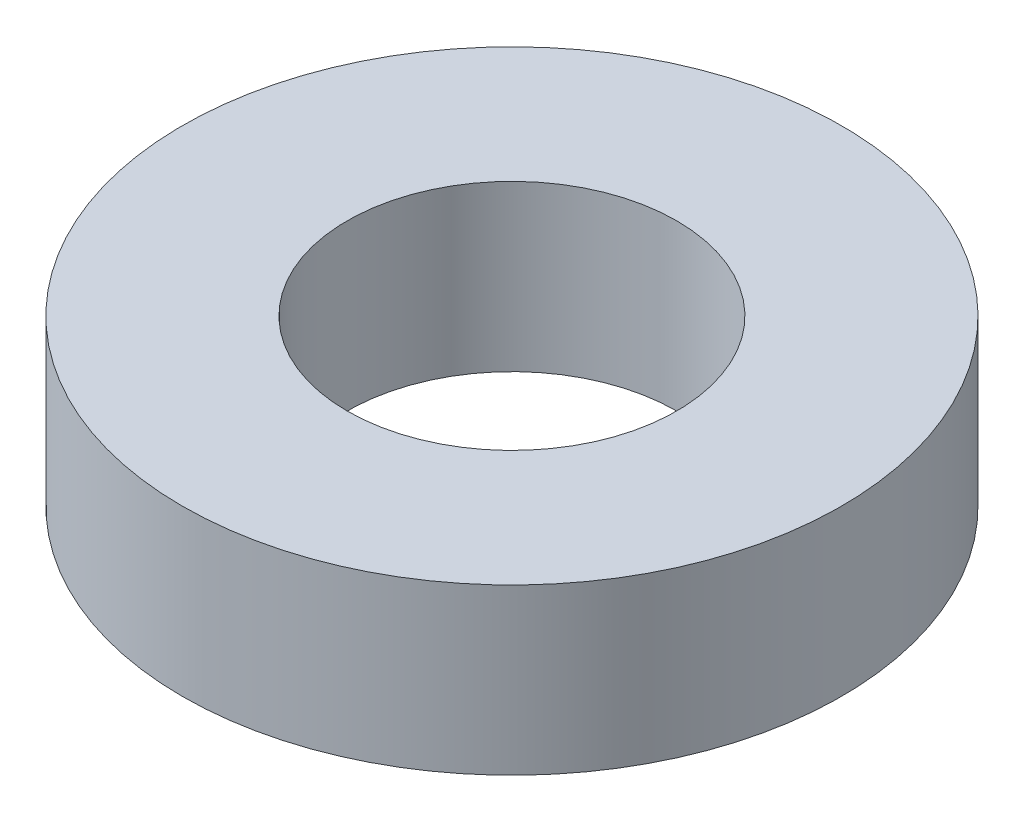
ISO-10303-21;
HEADER;
FILE_DESCRIPTION(('STEP AP214'),'2;1');
FILE_NAME('part.step','',(''),(''),'','','');
FILE_SCHEMA(('AUTOMOTIVE_DESIGN { 1 0 10303 214 1 1 1 1 }'));
ENDSEC;
DATA;
#1=APPLICATION_CONTEXT('core data for automotive mechanical design processes');
#2=APPLICATION_PROTOCOL_DEFINITION('international standard','automotive_design',2000,#1);
#3=PRODUCT_CONTEXT('',#1,'mechanical');
#4=PRODUCT('Part','Part','',(#3));
#5=PRODUCT_RELATED_PRODUCT_CATEGORY('part','',(#4));
#6=PRODUCT_DEFINITION_FORMATION('','',#4);
#7=PRODUCT_DEFINITION_CONTEXT('part definition',#1,'design');
#8=PRODUCT_DEFINITION('design','',#6,#7);
#9=PRODUCT_DEFINITION_SHAPE('','',#8);
#10=(LENGTH_UNIT() NAMED_UNIT(*) SI_UNIT(.MILLI.,.METRE.));
#11=(NAMED_UNIT(*) PLANE_ANGLE_UNIT() SI_UNIT($,.RADIAN.));
#12=(NAMED_UNIT(*) SI_UNIT($,.STERADIAN.) SOLID_ANGLE_UNIT());
#13=UNCERTAINTY_MEASURE_WITH_UNIT(LENGTH_MEASURE(1.E-05),#10,'distance_accuracy_value','');
#14=(GEOMETRIC_REPRESENTATION_CONTEXT(3) GLOBAL_UNCERTAINTY_ASSIGNED_CONTEXT((#13)) GLOBAL_UNIT_ASSIGNED_CONTEXT((#10,
#11,#12)) REPRESENTATION_CONTEXT('',''));
#15=CARTESIAN_POINT('',(0.,0.,0.));
#16=DIRECTION('',(0.,0.,1.));
#17=DIRECTION('',(1.,0.,0.));
#18=AXIS2_PLACEMENT_3D('',#15,#16,#17);
#19=CARTESIAN_POINT('',(0.,10.,0.));
#20=DIRECTION('',(0.,1.,0.));
#21=DIRECTION('',(0.,0.,1.));
#22=AXIS2_PLACEMENT_3D('',#19,#20,#21);
#23=PLANE('',#22);
#24=CARTESIAN_POINT('',(0.,10.,0.));
#25=DIRECTION('',(0.,1.,0.));
#26=DIRECTION('',(0.,0.,1.));
#27=AXIS2_PLACEMENT_3D('',#24,#25,#26);
#28=CIRCLE('',#27,20.);
#29=CARTESIAN_POINT('',(0.,10.,20.));
#30=VERTEX_POINT('',#29);
#31=EDGE_CURVE('E10',#30,#30,#28,.T.);
#32=ORIENTED_EDGE('',*,*,#31,.T.);
#33=EDGE_LOOP('',(#32));
#34=FACE_BOUND('',#33,.T.);
#35=CARTESIAN_POINT('',(0.,10.,0.));
#36=DIRECTION('',(0.,1.,0.));
#37=DIRECTION('',(0.,0.,1.));
#38=AXIS2_PLACEMENT_3D('',#35,#36,#37);
#39=CIRCLE('',#38,10.);
#40=CARTESIAN_POINT('',(0.,10.,10.));
#41=VERTEX_POINT('',#40);
#42=EDGE_CURVE('E44',#41,#41,#39,.T.);
#43=ORIENTED_EDGE('',*,*,#42,.F.);
#44=EDGE_LOOP('',(#43));
#45=FACE_BOUND('',#44,.T.);
#46=ADVANCED_FACE('F33',(#34,#45),#23,.T.);
#47=CARTESIAN_POINT('',(0.,0.,0.));
#48=DIRECTION('',(0.,1.,0.));
#49=DIRECTION('',(0.,0.,1.));
#50=AXIS2_PLACEMENT_3D('',#47,#48,#49);
#51=PLANE('',#50);
#52=CARTESIAN_POINT('',(0.,0.,0.));
#53=DIRECTION('',(0.,1.,0.));
#54=DIRECTION('',(0.,0.,1.));
#55=AXIS2_PLACEMENT_3D('',#52,#53,#54);
#56=CIRCLE('',#55,20.);
#57=CARTESIAN_POINT('',(0.,0.,20.));
#58=VERTEX_POINT('',#57);
#59=EDGE_CURVE('E37',#58,#58,#56,.T.);
#60=ORIENTED_EDGE('',*,*,#59,.F.);
#61=EDGE_LOOP('',(#60));
#62=FACE_BOUND('',#61,.T.);
#63=CARTESIAN_POINT('',(0.,0.,0.));
#64=DIRECTION('',(0.,1.,0.));
#65=DIRECTION('',(0.,0.,1.));
#66=AXIS2_PLACEMENT_3D('',#63,#64,#65);
#67=CIRCLE('',#66,10.);
#68=CARTESIAN_POINT('',(0.,0.,10.));
#69=VERTEX_POINT('',#68);
#70=EDGE_CURVE('E46',#69,#69,#67,.T.);
#71=ORIENTED_EDGE('',*,*,#70,.T.);
#72=EDGE_LOOP('',(#71));
#73=FACE_BOUND('',#72,.T.);
#74=ADVANCED_FACE('F56',(#62,#73),#51,.F.);
#75=CARTESIAN_POINT('',(0.,10.,0.));
#76=DIRECTION('',(0.,-1.,0.));
#77=DIRECTION('',(0.,0.,-1.));
#78=AXIS2_PLACEMENT_3D('',#75,#76,#77);
#79=CYLINDRICAL_SURFACE('',#78,20.);
#80=ORIENTED_EDGE('',*,*,#31,.F.);
#81=EDGE_LOOP('',(#80));
#82=FACE_BOUND('',#81,.T.);
#83=ORIENTED_EDGE('',*,*,#59,.T.);
#84=EDGE_LOOP('',(#83));
#85=FACE_BOUND('',#84,.T.);
#86=ADVANCED_FACE('F35',(#82,#85),#79,.T.);
#87=CARTESIAN_POINT('',(0.,10.,0.));
#88=DIRECTION('',(0.,-1.,0.));
#89=DIRECTION('',(0.,0.,-1.));
#90=AXIS2_PLACEMENT_3D('',#87,#88,#89);
#91=CYLINDRICAL_SURFACE('',#90,10.);
#92=ORIENTED_EDGE('',*,*,#42,.T.);
#93=EDGE_LOOP('',(#92));
#94=FACE_BOUND('',#93,.T.);
#95=ORIENTED_EDGE('',*,*,#70,.F.);
#96=EDGE_LOOP('',(#95));
#97=FACE_BOUND('',#96,.T.);
#98=ADVANCED_FACE('F52',(#94,#97),#91,.F.);
#99=CLOSED_SHELL('',(#46,#74,#86,#98));
#100=MANIFOLD_SOLID_BREP('B2',#99);
#101=ADVANCED_BREP_SHAPE_REPRESENTATION('',(#18,#100),#14);
#102=SHAPE_DEFINITION_REPRESENTATION(#9,#101);
ENDSEC;
END-ISO-10303-21;
